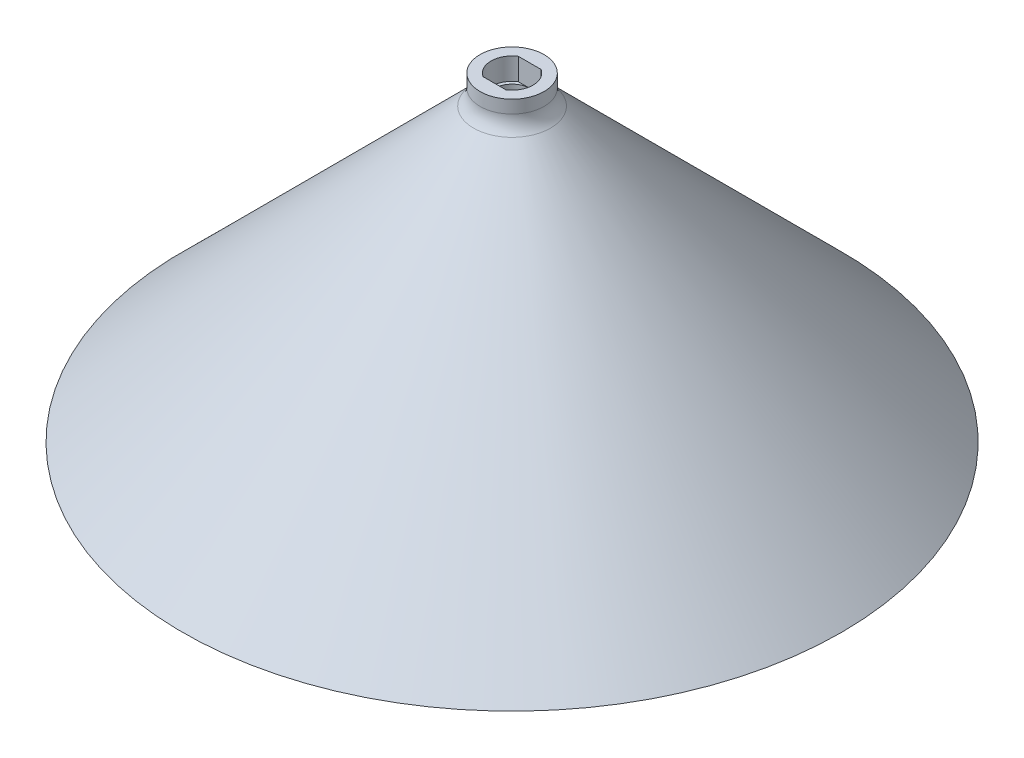
ISO-10303-21;
HEADER;
FILE_DESCRIPTION(('STEP AP214'),'2;1');
FILE_NAME('part.step','',(''),(''),'','','');
FILE_SCHEMA(('AUTOMOTIVE_DESIGN { 1 0 10303 214 1 1 1 1 }'));
ENDSEC;
DATA;
#1=APPLICATION_CONTEXT('core data for automotive mechanical design processes');
#2=APPLICATION_PROTOCOL_DEFINITION('international standard','automotive_design',2000,#1);
#3=PRODUCT_CONTEXT('',#1,'mechanical');
#4=PRODUCT('Part','Part','',(#3));
#5=PRODUCT_RELATED_PRODUCT_CATEGORY('part','',(#4));
#6=PRODUCT_DEFINITION_FORMATION('','',#4);
#7=PRODUCT_DEFINITION_CONTEXT('part definition',#1,'design');
#8=PRODUCT_DEFINITION('design','',#6,#7);
#9=PRODUCT_DEFINITION_SHAPE('','',#8);
#10=(LENGTH_UNIT() NAMED_UNIT(*) SI_UNIT(.MILLI.,.METRE.));
#11=(NAMED_UNIT(*) PLANE_ANGLE_UNIT() SI_UNIT($,.RADIAN.));
#12=(NAMED_UNIT(*) SI_UNIT($,.STERADIAN.) SOLID_ANGLE_UNIT());
#13=UNCERTAINTY_MEASURE_WITH_UNIT(LENGTH_MEASURE(1.E-05),#10,'distance_accuracy_value','');
#14=(GEOMETRIC_REPRESENTATION_CONTEXT(3) GLOBAL_UNCERTAINTY_ASSIGNED_CONTEXT((#13)) GLOBAL_UNIT_ASSIGNED_CONTEXT((#10,
#11,#12)) REPRESENTATION_CONTEXT('',''));
#15=CARTESIAN_POINT('',(0.,0.,0.));
#16=DIRECTION('',(0.,0.,1.));
#17=DIRECTION('',(1.,0.,0.));
#18=AXIS2_PLACEMENT_3D('',#15,#16,#17);
#19=CARTESIAN_POINT('',(0.,10.,0.));
#20=DIRECTION('',(0.,-1.,0.));
#21=DIRECTION('',(0.,0.,-1.));
#22=AXIS2_PLACEMENT_3D('',#19,#20,#21);
#23=CYLINDRICAL_SURFACE('',#22,14.525);
#24=CARTESIAN_POINT('',(0.,4.14213562373097,0.));
#25=DIRECTION('',(0.,-1.,0.));
#26=DIRECTION('',(1.,0.,0.));
#27=AXIS2_PLACEMENT_3D('',#24,#25,#26);
#28=CIRCLE('',#27,14.525);
#29=CARTESIAN_POINT('',(14.525,4.14213562373097,0.));
#30=VERTEX_POINT('',#29);
#31=EDGE_CURVE('E11',#30,#30,#28,.F.);
#32=ORIENTED_EDGE('',*,*,#31,.T.);
#33=EDGE_LOOP('',(#32));
#34=FACE_BOUND('',#33,.T.);
#35=CARTESIAN_POINT('',(0.,10.,0.));
#36=DIRECTION('',(0.,1.,0.));
#37=DIRECTION('',(0.,0.,1.));
#38=AXIS2_PLACEMENT_3D('',#35,#36,#37);
#39=CIRCLE('',#38,14.525);
#40=CARTESIAN_POINT('',(0.,10.,14.525));
#41=VERTEX_POINT('',#40);
#42=EDGE_CURVE('E115',#41,#41,#39,.T.);
#43=ORIENTED_EDGE('',*,*,#42,.F.);
#44=EDGE_LOOP('',(#43));
#45=FACE_BOUND('',#44,.T.);
#46=ADVANCED_FACE('F33',(#34,#45),#23,.T.);
#47=CARTESIAN_POINT('',(0.,10.,0.));
#48=DIRECTION('',(0.,1.,0.));
#49=DIRECTION('',(0.,0.,1.));
#50=AXIS2_PLACEMENT_3D('',#47,#48,#49);
#51=PLANE('',#50);
#52=ORIENTED_EDGE('',*,*,#42,.T.);
#53=EDGE_LOOP('',(#52));
#54=FACE_BOUND('',#53,.T.);
#55=DIRECTION('',(1.,0.,0.));
#56=VECTOR('',#55,1.);
#57=CARTESIAN_POINT('',(-5.168,10.,8.00108748858554));
#58=LINE('',#57,#56);
#59=CARTESIAN_POINT('',(-5.168,10.,8.00108748858554));
#60=VERTEX_POINT('',#59);
#61=CARTESIAN_POINT('',(5.168,10.,8.00108748858554));
#62=VERTEX_POINT('',#61);
#63=EDGE_CURVE('E260',#60,#62,#58,.T.);
#64=ORIENTED_EDGE('',*,*,#63,.F.);
#65=CARTESIAN_POINT('',(0.,10.,0.));
#66=DIRECTION('',(0.,1.,0.));
#67=DIRECTION('',(0.,0.,1.));
#68=AXIS2_PLACEMENT_3D('',#65,#66,#67);
#69=CIRCLE('',#68,9.525);
#70=CARTESIAN_POINT('',(-5.168,10.,-8.00108748858554));
#71=VERTEX_POINT('',#70);
#72=EDGE_CURVE('E105',#71,#60,#69,.T.);
#73=ORIENTED_EDGE('',*,*,#72,.F.);
#74=DIRECTION('',(-1.,0.,0.));
#75=VECTOR('',#74,1.);
#76=CARTESIAN_POINT('',(-5.168,10.,-8.00108748858554));
#77=LINE('',#76,#75);
#78=CARTESIAN_POINT('',(5.168,10.,-8.00108748858554));
#79=VERTEX_POINT('',#78);
#80=EDGE_CURVE('E83',#79,#71,#77,.T.);
#81=ORIENTED_EDGE('',*,*,#80,.F.);
#82=CARTESIAN_POINT('',(0.,10.,0.));
#83=DIRECTION('',(0.,1.,0.));
#84=DIRECTION('',(0.,0.,1.));
#85=AXIS2_PLACEMENT_3D('',#82,#83,#84);
#86=CIRCLE('',#85,9.525);
#87=EDGE_CURVE('E262',#62,#79,#86,.T.);
#88=ORIENTED_EDGE('',*,*,#87,.F.);
#89=EDGE_LOOP('',(#64,#73,#81,#88));
#90=FACE_BOUND('',#89,.T.);
#91=ADVANCED_FACE('F133',(#54,#90),#51,.T.);
#92=CARTESIAN_POINT('',(0.,10.,0.));
#93=DIRECTION('',(0.,-1.,0.));
#94=DIRECTION('',(0.,0.,-1.));
#95=AXIS2_PLACEMENT_3D('',#92,#93,#94);
#96=CYLINDRICAL_SURFACE('',#95,9.525);
#97=CARTESIAN_POINT('',(0.,0.,0.));
#98=DIRECTION('',(0.,1.,0.));
#99=DIRECTION('',(0.,0.,1.));
#100=AXIS2_PLACEMENT_3D('',#97,#98,#99);
#101=CIRCLE('',#100,9.525);
#102=CARTESIAN_POINT('',(-5.168,0.,-8.00108748858554));
#103=VERTEX_POINT('',#102);
#104=CARTESIAN_POINT('',(-5.168,0.,8.00108748858554));
#105=VERTEX_POINT('',#104);
#106=EDGE_CURVE('E90',#103,#105,#101,.T.);
#107=ORIENTED_EDGE('',*,*,#106,.F.);
#108=DIRECTION('',(0.,-1.,0.));
#109=VECTOR('',#108,1.);
#110=CARTESIAN_POINT('',(-5.168,10.,-8.00108748858554));
#111=LINE('',#110,#109);
#112=EDGE_CURVE('E79',#71,#103,#111,.T.);
#113=ORIENTED_EDGE('',*,*,#112,.F.);
#114=ORIENTED_EDGE('',*,*,#72,.T.);
#115=DIRECTION('',(0.,-1.,0.));
#116=VECTOR('',#115,1.);
#117=CARTESIAN_POINT('',(-5.168,10.,8.00108748858554));
#118=LINE('',#117,#116);
#119=EDGE_CURVE('E93',#60,#105,#118,.T.);
#120=ORIENTED_EDGE('',*,*,#119,.T.);
#121=EDGE_LOOP('',(#107,#113,#114,#120));
#122=FACE_BOUND('',#121,.T.);
#123=ADVANCED_FACE('F91',(#122),#96,.F.);
#124=CARTESIAN_POINT('',(-5.168,10.,8.00108748858554));
#125=DIRECTION('',(0.,0.,-1.));
#126=DIRECTION('',(-1.,0.,0.));
#127=AXIS2_PLACEMENT_3D('',#124,#125,#126);
#128=PLANE('',#127);
#129=DIRECTION('',(1.,0.,0.));
#130=VECTOR('',#129,1.);
#131=CARTESIAN_POINT('',(-5.168,0.,8.00108748858554));
#132=LINE('',#131,#130);
#133=CARTESIAN_POINT('',(0.,0.,8.00108748858553));
#134=VERTEX_POINT('',#133);
#135=EDGE_CURVE('E107',#105,#134,#132,.T.);
#136=ORIENTED_EDGE('',*,*,#135,.F.);
#137=ORIENTED_EDGE('',*,*,#119,.F.);
#138=ORIENTED_EDGE('',*,*,#63,.T.);
#139=DIRECTION('',(0.,-1.,0.));
#140=VECTOR('',#139,1.);
#141=CARTESIAN_POINT('',(5.168,10.,8.00108748858554));
#142=LINE('',#141,#140);
#143=CARTESIAN_POINT('',(5.168,0.,8.00108748858554));
#144=VERTEX_POINT('',#143);
#145=EDGE_CURVE('E112',#62,#144,#142,.T.);
#146=ORIENTED_EDGE('',*,*,#145,.T.);
#147=EDGE_CURVE('E56',#134,#144,#132,.T.);
#148=ORIENTED_EDGE('',*,*,#147,.F.);
#149=EDGE_LOOP('',(#136,#137,#138,#146,#148));
#150=FACE_BOUND('',#149,.T.);
#151=ADVANCED_FACE('F146',(#150),#128,.T.);
#152=CARTESIAN_POINT('',(0.,10.,0.));
#153=DIRECTION('',(0.,-1.,0.));
#154=DIRECTION('',(0.,0.,-1.));
#155=AXIS2_PLACEMENT_3D('',#152,#153,#154);
#156=CYLINDRICAL_SURFACE('',#155,9.525);
#157=CARTESIAN_POINT('',(0.,0.,0.));
#158=DIRECTION('',(0.,1.,0.));
#159=DIRECTION('',(0.,0.,1.));
#160=AXIS2_PLACEMENT_3D('',#157,#158,#159);
#161=CIRCLE('',#160,9.525);
#162=CARTESIAN_POINT('',(5.168,0.,-8.00108748858554));
#163=VERTEX_POINT('',#162);
#164=EDGE_CURVE('E103',#144,#163,#161,.T.);
#165=ORIENTED_EDGE('',*,*,#164,.F.);
#166=ORIENTED_EDGE('',*,*,#145,.F.);
#167=ORIENTED_EDGE('',*,*,#87,.T.);
#168=DIRECTION('',(0.,-1.,0.));
#169=VECTOR('',#168,1.);
#170=CARTESIAN_POINT('',(5.168,10.,-8.00108748858554));
#171=LINE('',#170,#169);
#172=EDGE_CURVE('E86',#79,#163,#171,.T.);
#173=ORIENTED_EDGE('',*,*,#172,.T.);
#174=EDGE_LOOP('',(#165,#166,#167,#173));
#175=FACE_BOUND('',#174,.T.);
#176=ADVANCED_FACE('F149',(#175),#156,.F.);
#177=CARTESIAN_POINT('',(-5.168,10.,-8.00108748858554));
#178=DIRECTION('',(0.,0.,1.));
#179=DIRECTION('',(1.,0.,0.));
#180=AXIS2_PLACEMENT_3D('',#177,#178,#179);
#181=PLANE('',#180);
#182=DIRECTION('',(-1.,0.,0.));
#183=VECTOR('',#182,1.);
#184=CARTESIAN_POINT('',(-5.168,0.,-8.00108748858554));
#185=LINE('',#184,#183);
#186=CARTESIAN_POINT('',(0.,0.,-8.00108748858553));
#187=VERTEX_POINT('',#186);
#188=EDGE_CURVE('E102',#163,#187,#185,.T.);
#189=ORIENTED_EDGE('',*,*,#188,.F.);
#190=ORIENTED_EDGE('',*,*,#172,.F.);
#191=ORIENTED_EDGE('',*,*,#80,.T.);
#192=ORIENTED_EDGE('',*,*,#112,.T.);
#193=EDGE_CURVE('E48',#187,#103,#185,.T.);
#194=ORIENTED_EDGE('',*,*,#193,.F.);
#195=EDGE_LOOP('',(#189,#190,#191,#192,#194));
#196=FACE_BOUND('',#195,.T.);
#197=ADVANCED_FACE('F81',(#196),#181,.T.);
#198=CARTESIAN_POINT('',(0.,0.,0.));
#199=DIRECTION('',(0.,-1.,0.));
#200=DIRECTION('',(0.,0.,-1.));
#201=AXIS2_PLACEMENT_3D('',#198,#199,#200);
#202=PLANE('',#201);
#203=ORIENTED_EDGE('',*,*,#193,.T.);
#204=ORIENTED_EDGE('',*,*,#106,.T.);
#205=ORIENTED_EDGE('',*,*,#135,.T.);
#206=CARTESIAN_POINT('',(0.,0.,0.));
#207=DIRECTION('',(0.,-1.,0.));
#208=DIRECTION('',(0.,0.,-1.));
#209=AXIS2_PLACEMENT_3D('',#206,#207,#208);
#210=CIRCLE('',#209,8.00108748858554);
#211=EDGE_CURVE('E100',#134,#187,#210,.T.);
#212=ORIENTED_EDGE('',*,*,#211,.T.);
#213=EDGE_LOOP('',(#203,#204,#205,#212));
#214=FACE_BOUND('',#213,.T.);
#215=ADVANCED_FACE('F98',(#214),#202,.F.);
#216=EDGE_CURVE('E95',#187,#134,#210,.T.);
#217=ORIENTED_EDGE('',*,*,#216,.T.);
#218=ORIENTED_EDGE('',*,*,#147,.T.);
#219=ORIENTED_EDGE('',*,*,#164,.T.);
#220=ORIENTED_EDGE('',*,*,#188,.T.);
#221=EDGE_LOOP('',(#217,#218,#219,#220));
#222=FACE_BOUND('',#221,.T.);
#223=ADVANCED_FACE('F155',(#222),#202,.F.);
#224=CARTESIAN_POINT('',(0.,-10.,0.));
#225=DIRECTION('',(0.,1.,0.));
#226=DIRECTION('',(0.,0.,1.));
#227=AXIS2_PLACEMENT_3D('',#224,#225,#226);
#228=CYLINDRICAL_SURFACE('',#227,8.00108748858554);
#229=CARTESIAN_POINT('',(0.,-10.,0.));
#230=DIRECTION('',(0.,1.,0.));
#231=DIRECTION('',(-1.,0.,0.));
#232=AXIS2_PLACEMENT_3D('',#229,#230,#231);
#233=CIRCLE('',#232,8.00108748858553);
#234=CARTESIAN_POINT('',(8.00108748858554,-10.,0.));
#235=VERTEX_POINT('',#234);
#236=EDGE_CURVE('E250',#235,#235,#233,.T.);
#237=ORIENTED_EDGE('',*,*,#236,.F.);
#238=EDGE_LOOP('',(#237));
#239=FACE_BOUND('',#238,.T.);
#240=ORIENTED_EDGE('',*,*,#216,.F.);
#241=ORIENTED_EDGE('',*,*,#211,.F.);
#242=EDGE_LOOP('',(#240,#241));
#243=FACE_BOUND('',#242,.T.);
#244=ADVANCED_FACE('F158',(#239,#243),#228,.F.);
#245=CARTESIAN_POINT('',(0.,-10.,0.));
#246=DIRECTION('',(0.,-1.,0.));
#247=DIRECTION('',(1.,0.,0.));
#248=AXIS2_PLACEMENT_3D('',#245,#246,#247);
#249=CONICAL_SURFACE('',#248,8.00108748858553,0.785398163397448);
#250=CARTESIAN_POINT('',(0.,-135.,0.));
#251=DIRECTION('',(0.,1.,0.));
#252=DIRECTION('',(-1.,0.,0.));
#253=AXIS2_PLACEMENT_3D('',#250,#251,#252);
#254=CIRCLE('',#253,133.001087488586);
#255=CARTESIAN_POINT('',(133.001087488586,-135.,0.));
#256=VERTEX_POINT('',#255);
#257=EDGE_CURVE('E247',#256,#256,#254,.T.);
#258=CARTESIAN_POINT('',(133.001087488586,-135.,0.));
#259=CARTESIAN_POINT('',(131.699004155252,-133.697916666667,0.));
#260=CARTESIAN_POINT('',(130.396920821919,-132.395833333333,0.));
#261=CARTESIAN_POINT('',(127.792754155252,-129.791666666667,0.));
#262=CARTESIAN_POINT('',(126.490670821919,-128.489583333333,0.));
#263=CARTESIAN_POINT('',(123.886504155252,-125.885416666667,0.));
#264=CARTESIAN_POINT('',(122.584420821919,-124.583333333333,0.));
#265=CARTESIAN_POINT('',(119.980254155252,-121.979166666667,0.));
#266=CARTESIAN_POINT('',(118.678170821919,-120.677083333333,0.));
#267=CARTESIAN_POINT('',(116.074004155252,-118.072916666667,0.));
#268=CARTESIAN_POINT('',(114.771920821919,-116.770833333333,0.));
#269=CARTESIAN_POINT('',(112.167754155252,-114.166666666667,0.));
#270=CARTESIAN_POINT('',(110.865670821919,-112.864583333333,0.));
#271=CARTESIAN_POINT('',(108.261504155252,-110.260416666667,0.));
#272=CARTESIAN_POINT('',(106.959420821919,-108.958333333333,0.));
#273=CARTESIAN_POINT('',(104.355254155252,-106.354166666667,0.));
#274=CARTESIAN_POINT('',(103.053170821919,-105.052083333333,0.));
#275=CARTESIAN_POINT('',(100.449004155252,-102.447916666667,0.));
#276=CARTESIAN_POINT('',(99.1469208219189,-101.145833333333,0.));
#277=CARTESIAN_POINT('',(96.5427541552522,-98.5416666666667,0.));
#278=CARTESIAN_POINT('',(95.2406708219189,-97.2395833333334,0.));
#279=CARTESIAN_POINT('',(92.6365041552522,-94.6354166666667,0.));
#280=CARTESIAN_POINT('',(91.3344208219189,-93.3333333333334,0.));
#281=CARTESIAN_POINT('',(88.7302541552522,-90.7291666666667,0.));
#282=CARTESIAN_POINT('',(87.4281708219189,-89.4270833333334,0.));
#283=CARTESIAN_POINT('',(84.8240041552522,-86.8229166666667,0.));
#284=CARTESIAN_POINT('',(83.5219208219189,-85.5208333333334,0.));
#285=CARTESIAN_POINT('',(80.9177541552522,-82.9166666666667,0.));
#286=CARTESIAN_POINT('',(79.6156708219189,-81.6145833333334,0.));
#287=CARTESIAN_POINT('',(77.0115041552522,-79.0104166666667,0.));
#288=CARTESIAN_POINT('',(75.7094208219189,-77.7083333333334,0.));
#289=CARTESIAN_POINT('',(73.1052541552522,-75.1041666666667,0.));
#290=CARTESIAN_POINT('',(71.8031708219189,-73.8020833333334,0.));
#291=CARTESIAN_POINT('',(69.1990041552522,-71.1979166666667,0.));
#292=CARTESIAN_POINT('',(67.8969208219189,-69.8958333333334,0.));
#293=CARTESIAN_POINT('',(65.2927541552522,-67.2916666666667,0.));
#294=CARTESIAN_POINT('',(63.9906708219189,-65.9895833333334,0.));
#295=CARTESIAN_POINT('',(61.3865041552522,-63.3854166666667,0.));
#296=CARTESIAN_POINT('',(60.0844208219189,-62.0833333333334,0.));
#297=CARTESIAN_POINT('',(57.4802541552522,-59.4791666666667,0.));
#298=CARTESIAN_POINT('',(56.1781708219189,-58.1770833333334,0.));
#299=CARTESIAN_POINT('',(53.5740041552522,-55.5729166666667,0.));
#300=CARTESIAN_POINT('',(52.2719208219189,-54.2708333333333,0.));
#301=CARTESIAN_POINT('',(49.6677541552522,-51.6666666666667,0.));
#302=CARTESIAN_POINT('',(48.3656708219189,-50.3645833333333,0.));
#303=CARTESIAN_POINT('',(45.7615041552522,-47.7604166666667,0.));
#304=CARTESIAN_POINT('',(44.4594208219189,-46.4583333333333,0.));
#305=CARTESIAN_POINT('',(41.8552541552522,-43.8541666666667,0.));
#306=CARTESIAN_POINT('',(40.5531708219189,-42.5520833333333,0.));
#307=CARTESIAN_POINT('',(37.9490041552522,-39.9479166666667,0.));
#308=CARTESIAN_POINT('',(36.6469208219189,-38.6458333333333,0.));
#309=CARTESIAN_POINT('',(34.0427541552522,-36.0416666666667,0.));
#310=CARTESIAN_POINT('',(32.7406708219189,-34.7395833333333,0.));
#311=CARTESIAN_POINT('',(30.1365041552522,-32.1354166666667,0.));
#312=CARTESIAN_POINT('',(28.8344208219189,-30.8333333333333,0.));
#313=CARTESIAN_POINT('',(26.2302541552522,-28.2291666666667,0.));
#314=CARTESIAN_POINT('',(24.9281708219189,-26.9270833333333,0.));
#315=CARTESIAN_POINT('',(22.3240041552522,-24.3229166666667,0.));
#316=CARTESIAN_POINT('',(21.0219208219189,-23.0208333333333,0.));
#317=CARTESIAN_POINT('',(18.4177541552522,-20.4166666666667,0.));
#318=CARTESIAN_POINT('',(17.1156708219189,-19.1145833333333,0.));
#319=CARTESIAN_POINT('',(14.5115041552522,-16.5104166666667,0.));
#320=CARTESIAN_POINT('',(13.2094208219189,-15.2083333333333,0.));
#321=CARTESIAN_POINT('',(10.6052541552522,-12.6041666666667,0.));
#322=CARTESIAN_POINT('',(9.30317082191887,-11.3020833333333,0.));
#323=CARTESIAN_POINT('',(8.00108748858554,-10.,0.));
#324=B_SPLINE_CURVE_WITH_KNOTS('',3,(#258,#259,#260,#261,#262,#263,#264,#265,#266,#267,#268,
#269,#270,#271,#272,#273,#274,#275,#276,#277,#278,#279,#280,#281,#282,#283,#284,#285,#286,#287,
#288,#289,#290,#291,#292,#293,#294,#295,#296,#297,#298,#299,#300,#301,#302,#303,#304,#305,#306,
#307,#308,#309,#310,#311,#312,#313,#314,#315,#316,#317,#318,#319,#320,#321,#322,#323),
.UNSPECIFIED.,.F.,.F.,(4,2,2,2,2,2,2,2,2,2,2,2,2,2,2,2,2,2,2,2,2,2,2,2,2,2,2,2,2,2,2,2,4),(0.,
5.52427172801988,11.0485434560398,16.5728151840597,22.0970869120796,27.6213586400995,
33.1456303681194,38.6699020961393,44.1941738241592,49.7184455521791,55.242717280199,
60.7669890082189,66.2912607362389,71.8155324642588,77.3398041922787,82.8640759202986,
88.3883476483185,93.9126193763384,99.4368911043583,104.961162832378,110.485434560398,
116.009706288418,121.533978016438,127.058249744458,132.582521472478,138.106793200498,
143.631064928518,149.155336656537,154.679608384557,160.203880112577,165.728151840597,
171.252423568617,176.776695296637),.UNSPECIFIED.);
#325=EDGE_CURVE('BSEAM162',#256,#235,#324,.T.);
#326=ORIENTED_EDGE('',*,*,#257,.F.);
#327=ORIENTED_EDGE('',*,*,#236,.T.);
#328=ORIENTED_EDGE('',*,*,#325,.T.);
#329=ORIENTED_EDGE('',*,*,#325,.F.);
#330=EDGE_LOOP('',(#326,#328,#327,#329));
#331=FACE_BOUND('',#330,.T.);
#332=ADVANCED_FACE('F162',(#331),#249,.F.);
#333=CARTESIAN_POINT('',(0.,-135.,0.));
#334=DIRECTION('',(0.,-1.,0.));
#335=DIRECTION('',(1.,0.,0.));
#336=AXIS2_PLACEMENT_3D('',#333,#334,#335);
#337=CONICAL_SURFACE('',#336,149.525,0.785398163397448);
#338=CARTESIAN_POINT('',(0.,-2.92893218813451,0.));
#339=DIRECTION('',(0.,-1.,0.));
#340=DIRECTION('',(1.,0.,0.));
#341=AXIS2_PLACEMENT_3D('',#338,#339,#340);
#342=CIRCLE('',#341,17.4539321881345);
#343=CARTESIAN_POINT('',(17.4539321881345,-2.92893218813453,0.));
#344=VERTEX_POINT('',#343);
#345=EDGE_CURVE('E41',#344,#344,#342,.T.);
#346=CARTESIAN_POINT('',(0.,-135.,0.));
#347=DIRECTION('',(0.,1.,0.));
#348=DIRECTION('',(-1.,0.,0.));
#349=AXIS2_PLACEMENT_3D('',#346,#347,#348);
#350=CIRCLE('',#349,149.525);
#351=CARTESIAN_POINT('',(149.525,-135.,0.));
#352=VERTEX_POINT('',#351);
#353=EDGE_CURVE('E251',#352,#352,#350,.T.);
#354=CARTESIAN_POINT('',(17.4539321881345,-2.92893218813453,0.));
#355=CARTESIAN_POINT('',(18.8296724778415,-4.30467247784146,0.));
#356=CARTESIAN_POINT('',(20.2054127675484,-5.68041276754839,0.));
#357=CARTESIAN_POINT('',(22.9568933469623,-8.43189334696226,0.));
#358=CARTESIAN_POINT('',(24.3326336366692,-9.80763363666919,0.));
#359=CARTESIAN_POINT('',(27.0841142160831,-12.5591142160831,0.));
#360=CARTESIAN_POINT('',(28.45985450579,-13.93485450579,0.));
#361=CARTESIAN_POINT('',(31.2113350852039,-16.6863350852039,0.));
#362=CARTESIAN_POINT('',(32.5870753749108,-18.0620753749108,0.));
#363=CARTESIAN_POINT('',(35.3385559543247,-20.8135559543246,0.));
#364=CARTESIAN_POINT('',(36.7142962440316,-22.1892962440316,0.));
#365=CARTESIAN_POINT('',(39.4657768234455,-24.9407768234454,0.));
#366=CARTESIAN_POINT('',(40.8415171131524,-26.3165171131524,0.));
#367=CARTESIAN_POINT('',(43.5929976925662,-29.0679976925662,0.));
#368=CARTESIAN_POINT('',(44.9687379822732,-30.4437379822732,0.));
#369=CARTESIAN_POINT('',(47.720218561687,-33.195218561687,0.));
#370=CARTESIAN_POINT('',(49.095958851394,-34.570958851394,0.));
#371=CARTESIAN_POINT('',(51.8474394308078,-37.3224394308078,0.));
#372=CARTESIAN_POINT('',(53.2231797205148,-38.6981797205148,0.));
#373=CARTESIAN_POINT('',(55.9746602999286,-41.4496602999286,0.));
#374=CARTESIAN_POINT('',(57.3504005896356,-42.8254005896356,0.));
#375=CARTESIAN_POINT('',(60.1018811690494,-45.5768811690494,0.));
#376=CARTESIAN_POINT('',(61.4776214587564,-46.9526214587563,0.));
#377=CARTESIAN_POINT('',(64.2291020381702,-49.7041020381702,0.));
#378=CARTESIAN_POINT('',(65.6048423278772,-51.0798423278771,0.));
#379=CARTESIAN_POINT('',(68.356322907291,-53.831322907291,0.));
#380=CARTESIAN_POINT('',(69.732063196998,-55.2070631969979,0.));
#381=CARTESIAN_POINT('',(72.4835437764118,-57.9585437764118,0.));
#382=CARTESIAN_POINT('',(73.8592840661188,-59.3342840661187,0.));
#383=CARTESIAN_POINT('',(76.6107646455326,-62.0857646455326,0.));
#384=CARTESIAN_POINT('',(77.9865049352396,-63.4615049352395,0.));
#385=CARTESIAN_POINT('',(80.7379855146534,-66.2129855146534,0.));
#386=CARTESIAN_POINT('',(82.1137258043604,-67.5887258043603,0.));
#387=CARTESIAN_POINT('',(84.8652063837742,-70.3402063837742,0.));
#388=CARTESIAN_POINT('',(86.2409466734811,-71.7159466734811,0.));
#389=CARTESIAN_POINT('',(88.992427252895,-74.467427252895,0.));
#390=CARTESIAN_POINT('',(90.3681675426019,-75.8431675426019,0.));
#391=CARTESIAN_POINT('',(93.1196481220158,-78.5946481220158,0.));
#392=CARTESIAN_POINT('',(94.4953884117227,-79.9703884117227,0.));
#393=CARTESIAN_POINT('',(97.2468689911366,-82.7218689911366,0.));
#394=CARTESIAN_POINT('',(98.6226092808435,-84.0976092808435,0.));
#395=CARTESIAN_POINT('',(101.374089860257,-86.8490898602574,0.));
#396=CARTESIAN_POINT('',(102.749830149964,-88.2248301499643,0.));
#397=CARTESIAN_POINT('',(105.501310729378,-90.9763107293782,0.));
#398=CARTESIAN_POINT('',(106.877051019085,-92.3520510190851,0.));
#399=CARTESIAN_POINT('',(109.628531598499,-95.103531598499,0.));
#400=CARTESIAN_POINT('',(111.004271888206,-96.4792718882059,0.));
#401=CARTESIAN_POINT('',(113.75575246762,-99.2307524676198,0.));
#402=CARTESIAN_POINT('',(115.131492757327,-100.606492757327,0.));
#403=CARTESIAN_POINT('',(117.882973336741,-103.357973336741,0.));
#404=CARTESIAN_POINT('',(119.258713626448,-104.733713626447,0.));
#405=CARTESIAN_POINT('',(122.010194205861,-107.485194205861,0.));
#406=CARTESIAN_POINT('',(123.385934495568,-108.860934495568,0.));
#407=CARTESIAN_POINT('',(126.137415074982,-111.612415074982,0.));
#408=CARTESIAN_POINT('',(127.513155364689,-112.988155364689,0.));
#409=CARTESIAN_POINT('',(130.264635944103,-115.739635944103,0.));
#410=CARTESIAN_POINT('',(131.64037623381,-117.11537623381,0.));
#411=CARTESIAN_POINT('',(134.391856813224,-119.866856813224,0.));
#412=CARTESIAN_POINT('',(135.767597102931,-121.242597102931,0.));
#413=CARTESIAN_POINT('',(138.519077682345,-123.994077682345,0.));
#414=CARTESIAN_POINT('',(139.894817972051,-125.369817972051,0.));
#415=CARTESIAN_POINT('',(142.646298551465,-128.121298551465,0.));
#416=CARTESIAN_POINT('',(144.022038841172,-129.497038841172,0.));
#417=CARTESIAN_POINT('',(146.773519420586,-132.248519420586,0.));
#418=CARTESIAN_POINT('',(148.149259710293,-133.624259710293,0.));
#419=CARTESIAN_POINT('',(149.525,-135.,0.));
#420=B_SPLINE_CURVE_WITH_KNOTS('',3,(#354,#355,#356,#357,#358,#359,#360,#361,#362,#363,#364,
#365,#366,#367,#368,#369,#370,#371,#372,#373,#374,#375,#376,#377,#378,#379,#380,#381,#382,#383,
#384,#385,#386,#387,#388,#389,#390,#391,#392,#393,#394,#395,#396,#397,#398,#399,#400,#401,#402,
#403,#404,#405,#406,#407,#408,#409,#410,#411,#412,#413,#414,#415,#416,#417,#418,#419),
.UNSPECIFIED.,.F.,.F.,(4,2,2,2,2,2,2,2,2,2,2,2,2,2,2,2,2,2,2,2,2,2,2,2,2,2,2,2,2,2,2,2,4),(0.,
5.83677172801989,11.6735434560398,17.5103151840597,23.3470869120796,29.1838586400995,
35.0206303681194,40.8574020961393,46.6941738241592,52.5309455521791,58.367717280199,
64.2044890082189,70.0412607362388,75.8780324642587,81.7148041922786,87.5515759202985,
93.3883476483185,99.2251193763384,105.061891104358,110.898662832378,116.735434560398,
122.572206288418,128.408978016438,134.245749744458,140.082521472478,145.919293200498,
151.756064928517,157.592836656537,163.429608384557,169.266380112577,175.103151840597,
180.939923568617,186.776695296637),.UNSPECIFIED.);
#421=EDGE_CURVE('BSEAM120',#344,#352,#420,.T.);
#422=ORIENTED_EDGE('',*,*,#345,.T.);
#423=ORIENTED_EDGE('',*,*,#353,.T.);
#424=ORIENTED_EDGE('',*,*,#421,.T.);
#425=ORIENTED_EDGE('',*,*,#421,.F.);
#426=EDGE_LOOP('',(#422,#424,#423,#425));
#427=FACE_BOUND('',#426,.T.);
#428=ADVANCED_FACE('F120',(#427),#337,.T.);
#429=CARTESIAN_POINT('',(149.525,-135.,0.));
#430=DIRECTION('',(0.,1.,0.));
#431=DIRECTION('',(-1.,0.,0.));
#432=AXIS2_PLACEMENT_3D('',#429,#430,#431);
#433=PLANE('',#432);
#434=ORIENTED_EDGE('',*,*,#353,.F.);
#435=EDGE_LOOP('',(#434));
#436=FACE_BOUND('',#435,.T.);
#437=ORIENTED_EDGE('',*,*,#257,.T.);
#438=EDGE_LOOP('',(#437));
#439=FACE_BOUND('',#438,.T.);
#440=ADVANCED_FACE('F124',(#436,#439),#433,.F.);
#441=CARTESIAN_POINT('',(0.,4.14213562373097,0.));
#442=DIRECTION('',(0.,-1.,0.));
#443=DIRECTION('',(1.,0.,0.));
#444=AXIS2_PLACEMENT_3D('',#441,#442,#443);
#445=TOROIDAL_SURFACE('',#444,24.525,10.);
#446=ORIENTED_EDGE('',*,*,#31,.F.);
#447=EDGE_LOOP('',(#446));
#448=FACE_BOUND('',#447,.T.);
#449=ORIENTED_EDGE('',*,*,#345,.F.);
#450=EDGE_LOOP('',(#449));
#451=FACE_BOUND('',#450,.T.);
#452=ADVANCED_FACE('F35',(#448,#451),#445,.F.);
#453=CLOSED_SHELL('',(#46,#91,#123,#151,#176,#197,#215,#223,#244,#332,#428,#440,#452));
#454=MANIFOLD_SOLID_BREP('B2',#453);
#455=ADVANCED_BREP_SHAPE_REPRESENTATION('',(#18,#454),#14);
#456=SHAPE_DEFINITION_REPRESENTATION(#9,#455);
ENDSEC;
END-ISO-10303-21;
